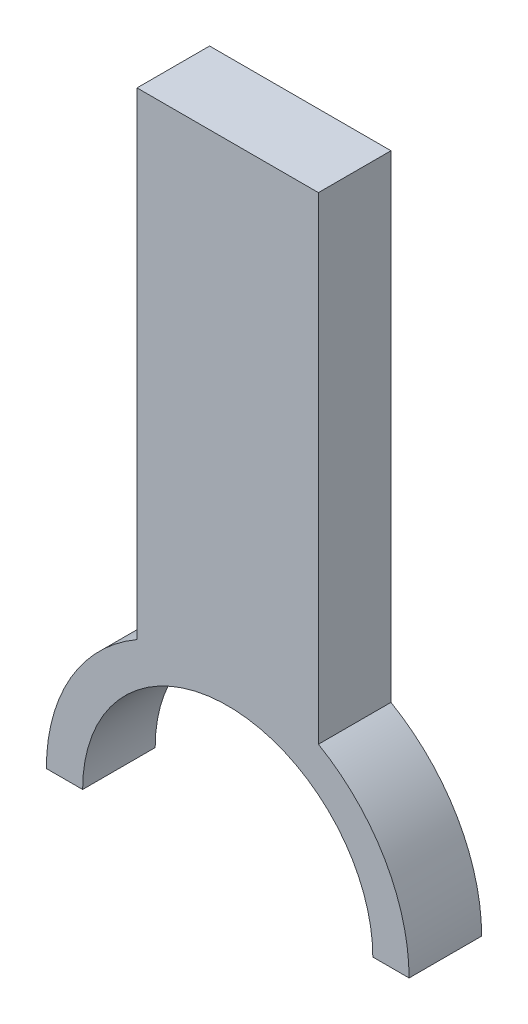
ISO-10303-21;
HEADER;
FILE_DESCRIPTION(('STEP AP214'),'2;1');
FILE_NAME('part.step','',(''),(''),'','','');
FILE_SCHEMA(('AUTOMOTIVE_DESIGN { 1 0 10303 214 1 1 1 1 }'));
ENDSEC;
DATA;
#1=APPLICATION_CONTEXT('core data for automotive mechanical design processes');
#2=APPLICATION_PROTOCOL_DEFINITION('international standard','automotive_design',2000,#1);
#3=PRODUCT_CONTEXT('',#1,'mechanical');
#4=PRODUCT('Part','Part','',(#3));
#5=PRODUCT_RELATED_PRODUCT_CATEGORY('part','',(#4));
#6=PRODUCT_DEFINITION_FORMATION('','',#4);
#7=PRODUCT_DEFINITION_CONTEXT('part definition',#1,'design');
#8=PRODUCT_DEFINITION('design','',#6,#7);
#9=PRODUCT_DEFINITION_SHAPE('','',#8);
#10=(LENGTH_UNIT() NAMED_UNIT(*) SI_UNIT(.MILLI.,.METRE.));
#11=(NAMED_UNIT(*) PLANE_ANGLE_UNIT() SI_UNIT($,.RADIAN.));
#12=(NAMED_UNIT(*) SI_UNIT($,.STERADIAN.) SOLID_ANGLE_UNIT());
#13=UNCERTAINTY_MEASURE_WITH_UNIT(LENGTH_MEASURE(1.E-05),#10,'distance_accuracy_value','');
#14=(GEOMETRIC_REPRESENTATION_CONTEXT(3) GLOBAL_UNCERTAINTY_ASSIGNED_CONTEXT((#13)) GLOBAL_UNIT_ASSIGNED_CONTEXT((#10,
#11,#12)) REPRESENTATION_CONTEXT('',''));
#15=CARTESIAN_POINT('',(0.,0.,0.));
#16=DIRECTION('',(0.,0.,1.));
#17=DIRECTION('',(1.,0.,0.));
#18=AXIS2_PLACEMENT_3D('',#15,#16,#17);
#19=CARTESIAN_POINT('',(0.,0.,4.));
#20=DIRECTION('',(0.,-1.,0.));
#21=DIRECTION('',(0.,0.,-1.));
#22=AXIS2_PLACEMENT_3D('',#19,#20,#21);
#23=PLANE('',#22);
#24=DIRECTION('',(-1.,0.,0.));
#25=VECTOR('',#24,1.);
#26=CARTESIAN_POINT('',(0.,0.,0.));
#27=LINE('',#26,#25);
#28=CARTESIAN_POINT('',(10.,0.,0.));
#29=VERTEX_POINT('',#28);
#30=CARTESIAN_POINT('',(8.,0.,0.));
#31=VERTEX_POINT('',#30);
#32=EDGE_CURVE('E129',#29,#31,#27,.T.);
#33=ORIENTED_EDGE('',*,*,#32,.F.);
#34=DIRECTION('',(0.,0.,-1.));
#35=VECTOR('',#34,1.);
#36=CARTESIAN_POINT('',(10.,0.,4.));
#37=LINE('',#36,#35);
#38=CARTESIAN_POINT('',(10.,0.,4.));
#39=VERTEX_POINT('',#38);
#40=EDGE_CURVE('E11',#39,#29,#37,.T.);
#41=ORIENTED_EDGE('',*,*,#40,.F.);
#42=DIRECTION('',(-1.,0.,0.));
#43=VECTOR('',#42,1.);
#44=CARTESIAN_POINT('',(0.,0.,4.));
#45=LINE('',#44,#43);
#46=CARTESIAN_POINT('',(8.,0.,4.));
#47=VERTEX_POINT('',#46);
#48=EDGE_CURVE('E148',#39,#47,#45,.T.);
#49=ORIENTED_EDGE('',*,*,#48,.T.);
#50=DIRECTION('',(0.,0.,-1.));
#51=VECTOR('',#50,1.);
#52=CARTESIAN_POINT('',(8.,0.,4.));
#53=LINE('',#52,#51);
#54=EDGE_CURVE('E51',#47,#31,#53,.T.);
#55=ORIENTED_EDGE('',*,*,#54,.T.);
#56=EDGE_LOOP('',(#33,#41,#49,#55));
#57=FACE_BOUND('',#56,.T.);
#58=ADVANCED_FACE('F35',(#57),#23,.T.);
#59=CARTESIAN_POINT('',(0.,0.,4.));
#60=DIRECTION('',(0.,0.,-1.));
#61=DIRECTION('',(-1.,0.,0.));
#62=AXIS2_PLACEMENT_3D('',#59,#60,#61);
#63=CYLINDRICAL_SURFACE('',#62,10.);
#64=CARTESIAN_POINT('',(0.,0.,0.));
#65=DIRECTION('',(0.,0.,1.));
#66=DIRECTION('',(1.,0.,0.));
#67=AXIS2_PLACEMENT_3D('',#64,#65,#66);
#68=CIRCLE('',#67,10.);
#69=CARTESIAN_POINT('',(5.,8.66025403784439,0.));
#70=VERTEX_POINT('',#69);
#71=EDGE_CURVE('E131',#29,#70,#68,.T.);
#72=ORIENTED_EDGE('',*,*,#71,.T.);
#73=DIRECTION('',(0.,0.,-1.));
#74=VECTOR('',#73,1.);
#75=CARTESIAN_POINT('',(5.,8.66025403784439,4.));
#76=LINE('',#75,#74);
#77=CARTESIAN_POINT('',(5.,8.66025403784439,4.));
#78=VERTEX_POINT('',#77);
#79=EDGE_CURVE('E43',#78,#70,#76,.T.);
#80=ORIENTED_EDGE('',*,*,#79,.F.);
#81=CARTESIAN_POINT('',(0.,0.,4.));
#82=DIRECTION('',(0.,0.,1.));
#83=DIRECTION('',(1.,0.,0.));
#84=AXIS2_PLACEMENT_3D('',#81,#82,#83);
#85=CIRCLE('',#84,10.);
#86=EDGE_CURVE('E174',#39,#78,#85,.T.);
#87=ORIENTED_EDGE('',*,*,#86,.F.);
#88=ORIENTED_EDGE('',*,*,#40,.T.);
#89=EDGE_LOOP('',(#72,#80,#87,#88));
#90=FACE_BOUND('',#89,.T.);
#91=ADVANCED_FACE('F189',(#90),#63,.T.);
#92=CARTESIAN_POINT('',(5.,0.,4.));
#93=DIRECTION('',(-1.,0.,0.));
#94=DIRECTION('',(0.,0.,1.));
#95=AXIS2_PLACEMENT_3D('',#92,#93,#94);
#96=PLANE('',#95);
#97=DIRECTION('',(0.,1.,0.));
#98=VECTOR('',#97,1.);
#99=CARTESIAN_POINT('',(5.,0.,0.));
#100=LINE('',#99,#98);
#101=CARTESIAN_POINT('',(5.,35.,0.));
#102=VERTEX_POINT('',#101);
#103=EDGE_CURVE('E133',#70,#102,#100,.T.);
#104=ORIENTED_EDGE('',*,*,#103,.T.);
#105=DIRECTION('',(0.,0.,-1.));
#106=VECTOR('',#105,1.);
#107=CARTESIAN_POINT('',(5.,35.,4.));
#108=LINE('',#107,#106);
#109=CARTESIAN_POINT('',(5.,35.,4.));
#110=VERTEX_POINT('',#109);
#111=EDGE_CURVE('E154',#110,#102,#108,.T.);
#112=ORIENTED_EDGE('',*,*,#111,.F.);
#113=DIRECTION('',(0.,1.,0.));
#114=VECTOR('',#113,1.);
#115=CARTESIAN_POINT('',(5.,0.,4.));
#116=LINE('',#115,#114);
#117=EDGE_CURVE('E162',#78,#110,#116,.T.);
#118=ORIENTED_EDGE('',*,*,#117,.F.);
#119=ORIENTED_EDGE('',*,*,#79,.T.);
#120=EDGE_LOOP('',(#104,#112,#118,#119));
#121=FACE_BOUND('',#120,.T.);
#122=ADVANCED_FACE('F160',(#121),#96,.F.);
#123=CARTESIAN_POINT('',(0.,35.,4.));
#124=DIRECTION('',(0.,1.,0.));
#125=DIRECTION('',(0.,0.,1.));
#126=AXIS2_PLACEMENT_3D('',#123,#124,#125);
#127=PLANE('',#126);
#128=DIRECTION('',(1.,0.,0.));
#129=VECTOR('',#128,1.);
#130=CARTESIAN_POINT('',(0.,35.,0.));
#131=LINE('',#130,#129);
#132=CARTESIAN_POINT('',(-5.,35.,0.));
#133=VERTEX_POINT('',#132);
#134=EDGE_CURVE('E136',#133,#102,#131,.T.);
#135=ORIENTED_EDGE('',*,*,#134,.F.);
#136=DIRECTION('',(0.,0.,-1.));
#137=VECTOR('',#136,1.);
#138=CARTESIAN_POINT('',(-5.,35.,4.));
#139=LINE('',#138,#137);
#140=CARTESIAN_POINT('',(-5.,35.,4.));
#141=VERTEX_POINT('',#140);
#142=EDGE_CURVE('E152',#141,#133,#139,.T.);
#143=ORIENTED_EDGE('',*,*,#142,.F.);
#144=DIRECTION('',(1.,0.,0.));
#145=VECTOR('',#144,1.);
#146=CARTESIAN_POINT('',(0.,35.,4.));
#147=LINE('',#146,#145);
#148=EDGE_CURVE('E172',#141,#110,#147,.T.);
#149=ORIENTED_EDGE('',*,*,#148,.T.);
#150=ORIENTED_EDGE('',*,*,#111,.T.);
#151=EDGE_LOOP('',(#135,#143,#149,#150));
#152=FACE_BOUND('',#151,.T.);
#153=ADVANCED_FACE('F170',(#152),#127,.T.);
#154=CARTESIAN_POINT('',(-5.,0.,4.));
#155=DIRECTION('',(-1.,0.,0.));
#156=DIRECTION('',(0.,-1.,0.));
#157=AXIS2_PLACEMENT_3D('',#154,#155,#156);
#158=PLANE('',#157);
#159=DIRECTION('',(0.,1.,0.));
#160=VECTOR('',#159,1.);
#161=CARTESIAN_POINT('',(-5.,0.,0.));
#162=LINE('',#161,#160);
#163=CARTESIAN_POINT('',(-5.,8.66025403784439,0.));
#164=VERTEX_POINT('',#163);
#165=EDGE_CURVE('E139',#164,#133,#162,.T.);
#166=ORIENTED_EDGE('',*,*,#165,.F.);
#167=DIRECTION('',(0.,0.,-1.));
#168=VECTOR('',#167,1.);
#169=CARTESIAN_POINT('',(-5.,8.66025403784439,4.));
#170=LINE('',#169,#168);
#171=CARTESIAN_POINT('',(-5.,8.66025403784439,4.));
#172=VERTEX_POINT('',#171);
#173=EDGE_CURVE('E121',#172,#164,#170,.T.);
#174=ORIENTED_EDGE('',*,*,#173,.F.);
#175=DIRECTION('',(0.,1.,0.));
#176=VECTOR('',#175,1.);
#177=CARTESIAN_POINT('',(-5.,0.,4.));
#178=LINE('',#177,#176);
#179=EDGE_CURVE('E111',#172,#141,#178,.T.);
#180=ORIENTED_EDGE('',*,*,#179,.T.);
#181=ORIENTED_EDGE('',*,*,#142,.T.);
#182=EDGE_LOOP('',(#166,#174,#180,#181));
#183=FACE_BOUND('',#182,.T.);
#184=ADVANCED_FACE('F200',(#183),#158,.T.);
#185=CARTESIAN_POINT('',(0.,0.,4.));
#186=DIRECTION('',(0.,0.,-1.));
#187=DIRECTION('',(-1.,0.,0.));
#188=AXIS2_PLACEMENT_3D('',#185,#186,#187);
#189=CYLINDRICAL_SURFACE('',#188,10.);
#190=CARTESIAN_POINT('',(0.,0.,0.));
#191=DIRECTION('',(0.,0.,1.));
#192=DIRECTION('',(1.,0.,0.));
#193=AXIS2_PLACEMENT_3D('',#190,#191,#192);
#194=CIRCLE('',#193,10.);
#195=CARTESIAN_POINT('',(-10.,0.,0.));
#196=VERTEX_POINT('',#195);
#197=EDGE_CURVE('E118',#164,#196,#194,.T.);
#198=ORIENTED_EDGE('',*,*,#197,.T.);
#199=DIRECTION('',(0.,0.,-1.));
#200=VECTOR('',#199,1.);
#201=CARTESIAN_POINT('',(-10.,0.,4.));
#202=LINE('',#201,#200);
#203=CARTESIAN_POINT('',(-10.,0.,4.));
#204=VERTEX_POINT('',#203);
#205=EDGE_CURVE('E115',#204,#196,#202,.T.);
#206=ORIENTED_EDGE('',*,*,#205,.F.);
#207=CARTESIAN_POINT('',(0.,0.,4.));
#208=DIRECTION('',(0.,0.,1.));
#209=DIRECTION('',(1.,0.,0.));
#210=AXIS2_PLACEMENT_3D('',#207,#208,#209);
#211=CIRCLE('',#210,10.);
#212=EDGE_CURVE('E102',#172,#204,#211,.T.);
#213=ORIENTED_EDGE('',*,*,#212,.F.);
#214=ORIENTED_EDGE('',*,*,#173,.T.);
#215=EDGE_LOOP('',(#198,#206,#213,#214));
#216=FACE_BOUND('',#215,.T.);
#217=ADVANCED_FACE('F116',(#216),#189,.T.);
#218=CARTESIAN_POINT('',(0.,0.,4.));
#219=DIRECTION('',(0.,-1.,0.));
#220=DIRECTION('',(0.,0.,-1.));
#221=AXIS2_PLACEMENT_3D('',#218,#219,#220);
#222=PLANE('',#221);
#223=DIRECTION('',(-1.,0.,0.));
#224=VECTOR('',#223,1.);
#225=CARTESIAN_POINT('',(0.,0.,0.));
#226=LINE('',#225,#224);
#227=CARTESIAN_POINT('',(-8.,0.,0.));
#228=VERTEX_POINT('',#227);
#229=EDGE_CURVE('E143',#228,#196,#226,.T.);
#230=ORIENTED_EDGE('',*,*,#229,.F.);
#231=DIRECTION('',(0.,0.,-1.));
#232=VECTOR('',#231,1.);
#233=CARTESIAN_POINT('',(-8.,0.,4.));
#234=LINE('',#233,#232);
#235=CARTESIAN_POINT('',(-8.,0.,4.));
#236=VERTEX_POINT('',#235);
#237=EDGE_CURVE('E76',#236,#228,#234,.T.);
#238=ORIENTED_EDGE('',*,*,#237,.F.);
#239=DIRECTION('',(-1.,0.,0.));
#240=VECTOR('',#239,1.);
#241=CARTESIAN_POINT('',(0.,0.,4.));
#242=LINE('',#241,#240);
#243=EDGE_CURVE('E108',#236,#204,#242,.T.);
#244=ORIENTED_EDGE('',*,*,#243,.T.);
#245=ORIENTED_EDGE('',*,*,#205,.T.);
#246=EDGE_LOOP('',(#230,#238,#244,#245));
#247=FACE_BOUND('',#246,.T.);
#248=ADVANCED_FACE('F123',(#247),#222,.T.);
#249=CARTESIAN_POINT('',(0.,0.,4.));
#250=DIRECTION('',(0.,0.,-1.));
#251=DIRECTION('',(-1.,0.,0.));
#252=AXIS2_PLACEMENT_3D('',#249,#250,#251);
#253=CYLINDRICAL_SURFACE('',#252,8.);
#254=CARTESIAN_POINT('',(0.,0.,0.));
#255=DIRECTION('',(0.,0.,1.));
#256=DIRECTION('',(1.,0.,0.));
#257=AXIS2_PLACEMENT_3D('',#254,#255,#256);
#258=CIRCLE('',#257,8.);
#259=EDGE_CURVE('E145',#31,#228,#258,.T.);
#260=ORIENTED_EDGE('',*,*,#259,.F.);
#261=ORIENTED_EDGE('',*,*,#54,.F.);
#262=CARTESIAN_POINT('',(0.,0.,4.));
#263=DIRECTION('',(0.,0.,1.));
#264=DIRECTION('',(1.,0.,0.));
#265=AXIS2_PLACEMENT_3D('',#262,#263,#264);
#266=CIRCLE('',#265,8.);
#267=EDGE_CURVE('E124',#47,#236,#266,.T.);
#268=ORIENTED_EDGE('',*,*,#267,.T.);
#269=ORIENTED_EDGE('',*,*,#237,.T.);
#270=EDGE_LOOP('',(#260,#261,#268,#269));
#271=FACE_BOUND('',#270,.T.);
#272=ADVANCED_FACE('F178',(#271),#253,.F.);
#273=CARTESIAN_POINT('',(0.,0.,4.));
#274=DIRECTION('',(0.,0.,1.));
#275=DIRECTION('',(1.,0.,0.));
#276=AXIS2_PLACEMENT_3D('',#273,#274,#275);
#277=PLANE('',#276);
#278=ORIENTED_EDGE('',*,*,#48,.F.);
#279=ORIENTED_EDGE('',*,*,#86,.T.);
#280=ORIENTED_EDGE('',*,*,#117,.T.);
#281=ORIENTED_EDGE('',*,*,#148,.F.);
#282=ORIENTED_EDGE('',*,*,#179,.F.);
#283=ORIENTED_EDGE('',*,*,#212,.T.);
#284=ORIENTED_EDGE('',*,*,#243,.F.);
#285=ORIENTED_EDGE('',*,*,#267,.F.);
#286=EDGE_LOOP('',(#278,#279,#280,#281,#282,#283,#284,#285));
#287=FACE_BOUND('',#286,.T.);
#288=ADVANCED_FACE('F105',(#287),#277,.T.);
#289=CARTESIAN_POINT('',(0.,0.,0.));
#290=DIRECTION('',(0.,0.,1.));
#291=DIRECTION('',(1.,0.,0.));
#292=AXIS2_PLACEMENT_3D('',#289,#290,#291);
#293=PLANE('',#292);
#294=ORIENTED_EDGE('',*,*,#32,.T.);
#295=ORIENTED_EDGE('',*,*,#259,.T.);
#296=ORIENTED_EDGE('',*,*,#229,.T.);
#297=ORIENTED_EDGE('',*,*,#197,.F.);
#298=ORIENTED_EDGE('',*,*,#165,.T.);
#299=ORIENTED_EDGE('',*,*,#134,.T.);
#300=ORIENTED_EDGE('',*,*,#103,.F.);
#301=ORIENTED_EDGE('',*,*,#71,.F.);
#302=EDGE_LOOP('',(#294,#295,#296,#297,#298,#299,#300,#301));
#303=FACE_BOUND('',#302,.T.);
#304=ADVANCED_FACE('F166',(#303),#293,.F.);
#305=CLOSED_SHELL('',(#58,#91,#122,#153,#184,#217,#248,#272,#288,#304));
#306=MANIFOLD_SOLID_BREP('B2',#305);
#307=ADVANCED_BREP_SHAPE_REPRESENTATION('',(#18,#306),#14);
#308=SHAPE_DEFINITION_REPRESENTATION(#9,#307);
ENDSEC;
END-ISO-10303-21;
